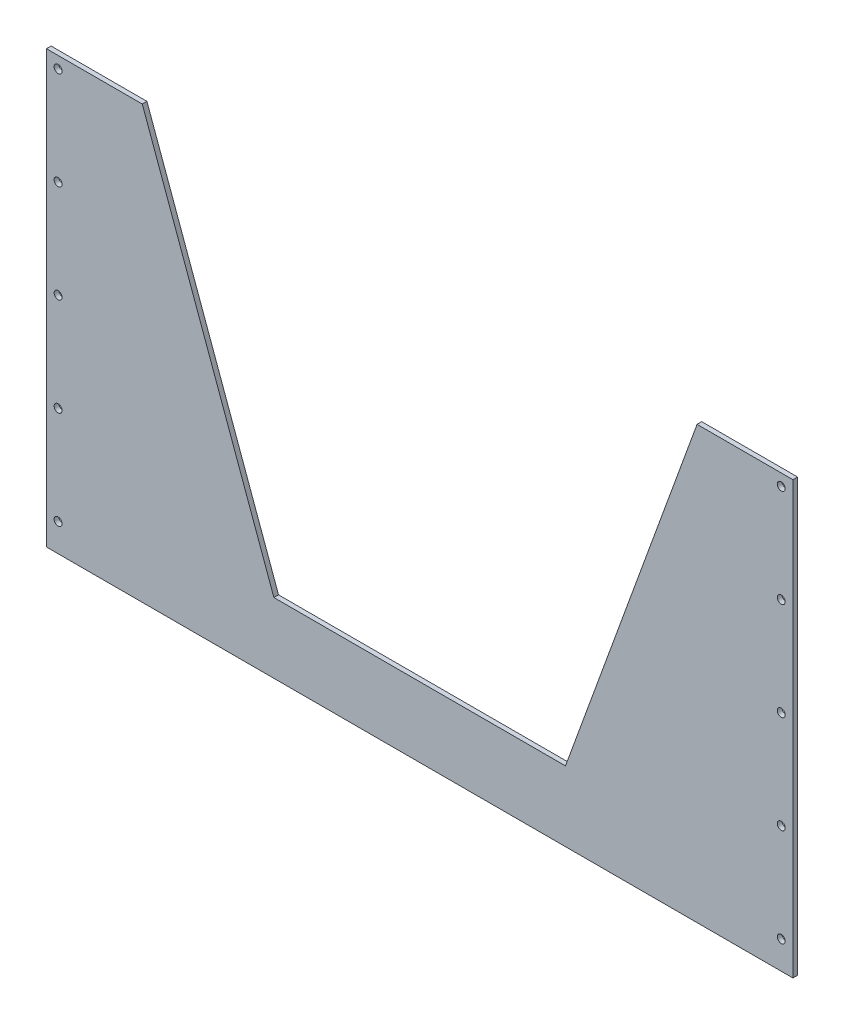
ISO-10303-21;
HEADER;
FILE_DESCRIPTION(('STEP AP214'),'2;1');
FILE_NAME('part.step','',(''),(''),'','','');
FILE_SCHEMA(('AUTOMOTIVE_DESIGN { 1 0 10303 214 1 1 1 1 }'));
ENDSEC;
DATA;
#1=APPLICATION_CONTEXT('core data for automotive mechanical design processes');
#2=APPLICATION_PROTOCOL_DEFINITION('international standard','automotive_design',2000,#1);
#3=PRODUCT_CONTEXT('',#1,'mechanical');
#4=PRODUCT('Part','Part','',(#3));
#5=PRODUCT_RELATED_PRODUCT_CATEGORY('part','',(#4));
#6=PRODUCT_DEFINITION_FORMATION('','',#4);
#7=PRODUCT_DEFINITION_CONTEXT('part definition',#1,'design');
#8=PRODUCT_DEFINITION('design','',#6,#7);
#9=PRODUCT_DEFINITION_SHAPE('','',#8);
#10=(LENGTH_UNIT() NAMED_UNIT(*) SI_UNIT(.MILLI.,.METRE.));
#11=(NAMED_UNIT(*) PLANE_ANGLE_UNIT() SI_UNIT($,.RADIAN.));
#12=(NAMED_UNIT(*) SI_UNIT($,.STERADIAN.) SOLID_ANGLE_UNIT());
#13=UNCERTAINTY_MEASURE_WITH_UNIT(LENGTH_MEASURE(1.E-05),#10,'distance_accuracy_value','');
#14=(GEOMETRIC_REPRESENTATION_CONTEXT(3) GLOBAL_UNCERTAINTY_ASSIGNED_CONTEXT((#13)) GLOBAL_UNIT_ASSIGNED_CONTEXT((#10,
#11,#12)) REPRESENTATION_CONTEXT('',''));
#15=CARTESIAN_POINT('',(0.,0.,0.));
#16=DIRECTION('',(0.,0.,1.));
#17=DIRECTION('',(1.,0.,0.));
#18=AXIS2_PLACEMENT_3D('',#15,#16,#17);
#19=CARTESIAN_POINT('',(160.,92.5,1.));
#20=DIRECTION('',(-1.,0.,0.));
#21=DIRECTION('',(0.,0.,1.));
#22=AXIS2_PLACEMENT_3D('',#19,#20,#21);
#23=PLANE('',#22);
#24=DIRECTION('',(0.,1.,0.));
#25=VECTOR('',#24,1.);
#26=CARTESIAN_POINT('',(160.,92.5,-1.));
#27=LINE('',#26,#25);
#28=CARTESIAN_POINT('',(160.,-92.5,-1.));
#29=VERTEX_POINT('',#28);
#30=CARTESIAN_POINT('',(160.,92.5,-1.));
#31=VERTEX_POINT('',#30);
#32=EDGE_CURVE('E133',#29,#31,#27,.T.);
#33=ORIENTED_EDGE('',*,*,#32,.T.);
#34=DIRECTION('',(0.,0.,-1.));
#35=VECTOR('',#34,1.);
#36=CARTESIAN_POINT('',(160.,92.5,1.));
#37=LINE('',#36,#35);
#38=CARTESIAN_POINT('',(160.,92.5,1.));
#39=VERTEX_POINT('',#38);
#40=EDGE_CURVE('E11',#39,#31,#37,.T.);
#41=ORIENTED_EDGE('',*,*,#40,.F.);
#42=DIRECTION('',(0.,1.,0.));
#43=VECTOR('',#42,1.);
#44=CARTESIAN_POINT('',(160.,92.5,1.));
#45=LINE('',#44,#43);
#46=CARTESIAN_POINT('',(160.,-92.5,1.));
#47=VERTEX_POINT('',#46);
#48=EDGE_CURVE('E147',#47,#39,#45,.T.);
#49=ORIENTED_EDGE('',*,*,#48,.F.);
#50=DIRECTION('',(0.,0.,-1.));
#51=VECTOR('',#50,1.);
#52=CARTESIAN_POINT('',(160.,-92.5,1.));
#53=LINE('',#52,#51);
#54=EDGE_CURVE('E129',#47,#29,#53,.T.);
#55=ORIENTED_EDGE('',*,*,#54,.T.);
#56=EDGE_LOOP('',(#33,#41,#49,#55));
#57=FACE_BOUND('',#56,.T.);
#58=ADVANCED_FACE('F35',(#57),#23,.F.);
#59=CARTESIAN_POINT('',(118.915386311261,92.5,1.));
#60=DIRECTION('',(0.,-1.,0.));
#61=DIRECTION('',(0.,0.,-1.));
#62=AXIS2_PLACEMENT_3D('',#59,#60,#61);
#63=PLANE('',#62);
#64=DIRECTION('',(-1.,0.,0.));
#65=VECTOR('',#64,1.);
#66=CARTESIAN_POINT('',(118.915386311261,92.5,-1.));
#67=LINE('',#66,#65);
#68=CARTESIAN_POINT('',(118.915386311261,92.5,-1.));
#69=VERTEX_POINT('',#68);
#70=EDGE_CURVE('E136',#31,#69,#67,.T.);
#71=ORIENTED_EDGE('',*,*,#70,.T.);
#72=DIRECTION('',(0.,0.,-1.));
#73=VECTOR('',#72,1.);
#74=CARTESIAN_POINT('',(118.915386311261,92.5,1.));
#75=LINE('',#74,#73);
#76=CARTESIAN_POINT('',(118.915386311261,92.5,1.));
#77=VERTEX_POINT('',#76);
#78=EDGE_CURVE('E44',#77,#69,#75,.T.);
#79=ORIENTED_EDGE('',*,*,#78,.F.);
#80=DIRECTION('',(-1.,0.,0.));
#81=VECTOR('',#80,1.);
#82=CARTESIAN_POINT('',(118.915386311261,92.5,1.));
#83=LINE('',#82,#81);
#84=EDGE_CURVE('E96',#39,#77,#83,.T.);
#85=ORIENTED_EDGE('',*,*,#84,.F.);
#86=ORIENTED_EDGE('',*,*,#40,.T.);
#87=EDGE_LOOP('',(#71,#79,#85,#86));
#88=FACE_BOUND('',#87,.T.);
#89=ADVANCED_FACE('F206',(#88),#63,.F.);
#90=CARTESIAN_POINT('',(62.5,-62.5,1.));
#91=DIRECTION('',(0.939692620785909,-0.342020143325666,0.));
#92=DIRECTION('',(0.342020143325666,0.93969262078591,0.));
#93=AXIS2_PLACEMENT_3D('',#90,#91,#92);
#94=PLANE('',#93);
#95=DIRECTION('',(-0.342020143325666,-0.939692620785909,0.));
#96=VECTOR('',#95,1.);
#97=CARTESIAN_POINT('',(62.5,-62.5,-1.));
#98=LINE('',#97,#96);
#99=CARTESIAN_POINT('',(62.5,-62.5,-1.));
#100=VERTEX_POINT('',#99);
#101=EDGE_CURVE('E138',#69,#100,#98,.T.);
#102=ORIENTED_EDGE('',*,*,#101,.T.);
#103=DIRECTION('',(0.,0.,-1.));
#104=VECTOR('',#103,1.);
#105=CARTESIAN_POINT('',(62.5,-62.5,1.));
#106=LINE('',#105,#104);
#107=CARTESIAN_POINT('',(62.5,-62.5,1.));
#108=VERTEX_POINT('',#107);
#109=EDGE_CURVE('E154',#108,#100,#106,.T.);
#110=ORIENTED_EDGE('',*,*,#109,.F.);
#111=DIRECTION('',(-0.342020143325666,-0.939692620785909,0.));
#112=VECTOR('',#111,1.);
#113=CARTESIAN_POINT('',(62.5,-62.5,1.));
#114=LINE('',#113,#112);
#115=EDGE_CURVE('E221',#77,#108,#114,.T.);
#116=ORIENTED_EDGE('',*,*,#115,.F.);
#117=ORIENTED_EDGE('',*,*,#78,.T.);
#118=EDGE_LOOP('',(#102,#110,#116,#117));
#119=FACE_BOUND('',#118,.T.);
#120=ADVANCED_FACE('F211',(#119),#94,.F.);
#121=CARTESIAN_POINT('',(-62.5,-62.5,1.));
#122=DIRECTION('',(0.,-1.,0.));
#123=DIRECTION('',(0.,0.,-1.));
#124=AXIS2_PLACEMENT_3D('',#121,#122,#123);
#125=PLANE('',#124);
#126=DIRECTION('',(-1.,0.,0.));
#127=VECTOR('',#126,1.);
#128=CARTESIAN_POINT('',(-62.5,-62.5,-1.));
#129=LINE('',#128,#127);
#130=CARTESIAN_POINT('',(-62.5,-62.5,-1.));
#131=VERTEX_POINT('',#130);
#132=EDGE_CURVE('E140',#100,#131,#129,.T.);
#133=ORIENTED_EDGE('',*,*,#132,.T.);
#134=DIRECTION('',(0.,0.,-1.));
#135=VECTOR('',#134,1.);
#136=CARTESIAN_POINT('',(-62.5,-62.5,1.));
#137=LINE('',#136,#135);
#138=CARTESIAN_POINT('',(-62.5,-62.5,1.));
#139=VERTEX_POINT('',#138);
#140=EDGE_CURVE('E151',#139,#131,#137,.T.);
#141=ORIENTED_EDGE('',*,*,#140,.F.);
#142=DIRECTION('',(-1.,0.,0.));
#143=VECTOR('',#142,1.);
#144=CARTESIAN_POINT('',(-62.5,-62.5,1.));
#145=LINE('',#144,#143);
#146=EDGE_CURVE('E223',#108,#139,#145,.T.);
#147=ORIENTED_EDGE('',*,*,#146,.F.);
#148=ORIENTED_EDGE('',*,*,#109,.T.);
#149=EDGE_LOOP('',(#133,#141,#147,#148));
#150=FACE_BOUND('',#149,.T.);
#151=ADVANCED_FACE('F287',(#150),#125,.F.);
#152=CARTESIAN_POINT('',(-118.915386311261,92.5,1.));
#153=DIRECTION('',(-0.939692620785909,-0.342020143325666,0.));
#154=DIRECTION('',(0.342020143325666,-0.93969262078591,0.));
#155=AXIS2_PLACEMENT_3D('',#152,#153,#154);
#156=PLANE('',#155);
#157=DIRECTION('',(-0.342020143325666,0.939692620785909,0.));
#158=VECTOR('',#157,1.);
#159=CARTESIAN_POINT('',(-118.915386311261,92.5,-1.));
#160=LINE('',#159,#158);
#161=CARTESIAN_POINT('',(-118.915386311261,92.5,-1.));
#162=VERTEX_POINT('',#161);
#163=EDGE_CURVE('E142',#131,#162,#160,.T.);
#164=ORIENTED_EDGE('',*,*,#163,.T.);
#165=DIRECTION('',(0.,0.,-1.));
#166=VECTOR('',#165,1.);
#167=CARTESIAN_POINT('',(-118.915386311261,92.5,1.));
#168=LINE('',#167,#166);
#169=CARTESIAN_POINT('',(-118.915386311261,92.5,1.));
#170=VERTEX_POINT('',#169);
#171=EDGE_CURVE('E124',#170,#162,#168,.T.);
#172=ORIENTED_EDGE('',*,*,#171,.F.);
#173=DIRECTION('',(-0.342020143325666,0.939692620785909,0.));
#174=VECTOR('',#173,1.);
#175=CARTESIAN_POINT('',(-118.915386311261,92.5,1.));
#176=LINE('',#175,#174);
#177=EDGE_CURVE('E115',#139,#170,#176,.T.);
#178=ORIENTED_EDGE('',*,*,#177,.F.);
#179=ORIENTED_EDGE('',*,*,#140,.T.);
#180=EDGE_LOOP('',(#164,#172,#178,#179));
#181=FACE_BOUND('',#180,.T.);
#182=ADVANCED_FACE('F284',(#181),#156,.F.);
#183=CARTESIAN_POINT('',(-160.,92.5,1.));
#184=DIRECTION('',(0.,-1.,0.));
#185=DIRECTION('',(0.,0.,-1.));
#186=AXIS2_PLACEMENT_3D('',#183,#184,#185);
#187=PLANE('',#186);
#188=DIRECTION('',(-1.,0.,0.));
#189=VECTOR('',#188,1.);
#190=CARTESIAN_POINT('',(-160.,92.5,-1.));
#191=LINE('',#190,#189);
#192=CARTESIAN_POINT('',(-160.,92.5,-1.));
#193=VERTEX_POINT('',#192);
#194=EDGE_CURVE('E123',#162,#193,#191,.T.);
#195=ORIENTED_EDGE('',*,*,#194,.T.);
#196=DIRECTION('',(0.,0.,-1.));
#197=VECTOR('',#196,1.);
#198=CARTESIAN_POINT('',(-160.,92.5,1.));
#199=LINE('',#198,#197);
#200=CARTESIAN_POINT('',(-160.,92.5,1.));
#201=VERTEX_POINT('',#200);
#202=EDGE_CURVE('E120',#201,#193,#199,.T.);
#203=ORIENTED_EDGE('',*,*,#202,.F.);
#204=DIRECTION('',(-1.,0.,0.));
#205=VECTOR('',#204,1.);
#206=CARTESIAN_POINT('',(-160.,92.5,1.));
#207=LINE('',#206,#205);
#208=EDGE_CURVE('E109',#170,#201,#207,.T.);
#209=ORIENTED_EDGE('',*,*,#208,.F.);
#210=ORIENTED_EDGE('',*,*,#171,.T.);
#211=EDGE_LOOP('',(#195,#203,#209,#210));
#212=FACE_BOUND('',#211,.T.);
#213=ADVANCED_FACE('F121',(#212),#187,.F.);
#214=CARTESIAN_POINT('',(-160.,92.5,1.));
#215=DIRECTION('',(1.,0.,0.));
#216=DIRECTION('',(0.,0.,-1.));
#217=AXIS2_PLACEMENT_3D('',#214,#215,#216);
#218=PLANE('',#217);
#219=DIRECTION('',(0.,-1.,0.));
#220=VECTOR('',#219,1.);
#221=CARTESIAN_POINT('',(-160.,92.5,-1.));
#222=LINE('',#221,#220);
#223=CARTESIAN_POINT('',(-160.,-92.5,-1.));
#224=VERTEX_POINT('',#223);
#225=EDGE_CURVE('E82',#193,#224,#222,.T.);
#226=ORIENTED_EDGE('',*,*,#225,.T.);
#227=DIRECTION('',(0.,0.,-1.));
#228=VECTOR('',#227,1.);
#229=CARTESIAN_POINT('',(-160.,-92.5,1.));
#230=LINE('',#229,#228);
#231=CARTESIAN_POINT('',(-160.,-92.5,1.));
#232=VERTEX_POINT('',#231);
#233=EDGE_CURVE('E125',#232,#224,#230,.T.);
#234=ORIENTED_EDGE('',*,*,#233,.F.);
#235=DIRECTION('',(0.,-1.,0.));
#236=VECTOR('',#235,1.);
#237=CARTESIAN_POINT('',(-160.,92.5,1.));
#238=LINE('',#237,#236);
#239=EDGE_CURVE('E113',#201,#232,#238,.T.);
#240=ORIENTED_EDGE('',*,*,#239,.F.);
#241=ORIENTED_EDGE('',*,*,#202,.T.);
#242=EDGE_LOOP('',(#226,#234,#240,#241));
#243=FACE_BOUND('',#242,.T.);
#244=ADVANCED_FACE('F127',(#243),#218,.F.);
#245=CARTESIAN_POINT('',(-160.,-92.5,1.));
#246=DIRECTION('',(0.,1.,0.));
#247=DIRECTION('',(0.,0.,1.));
#248=AXIS2_PLACEMENT_3D('',#245,#246,#247);
#249=PLANE('',#248);
#250=DIRECTION('',(1.,0.,0.));
#251=VECTOR('',#250,1.);
#252=CARTESIAN_POINT('',(-160.,-92.5,-1.));
#253=LINE('',#252,#251);
#254=EDGE_CURVE('E88',#224,#29,#253,.T.);
#255=ORIENTED_EDGE('',*,*,#254,.T.);
#256=ORIENTED_EDGE('',*,*,#54,.F.);
#257=DIRECTION('',(1.,0.,0.));
#258=VECTOR('',#257,1.);
#259=CARTESIAN_POINT('',(-160.,-92.5,1.));
#260=LINE('',#259,#258);
#261=EDGE_CURVE('E53',#232,#47,#260,.T.);
#262=ORIENTED_EDGE('',*,*,#261,.F.);
#263=ORIENTED_EDGE('',*,*,#233,.T.);
#264=EDGE_LOOP('',(#255,#256,#262,#263));
#265=FACE_BOUND('',#264,.T.);
#266=ADVANCED_FACE('F263',(#265),#249,.F.);
#267=CARTESIAN_POINT('',(0.,0.,1.));
#268=DIRECTION('',(0.,0.,1.));
#269=DIRECTION('',(1.,0.,0.));
#270=AXIS2_PLACEMENT_3D('',#267,#268,#269);
#271=PLANE('',#270);
#272=CARTESIAN_POINT('',(155.,87.5,1.));
#273=DIRECTION('',(0.,0.,1.));
#274=DIRECTION('',(-1.,0.,0.));
#275=AXIS2_PLACEMENT_3D('',#272,#273,#274);
#276=CIRCLE('',#275,1.70000000000001);
#277=CARTESIAN_POINT('',(153.3,87.5,1.));
#278=VERTEX_POINT('',#277);
#279=EDGE_CURVE('E232',#278,#278,#276,.T.);
#280=ORIENTED_EDGE('',*,*,#279,.F.);
#281=EDGE_LOOP('',(#280));
#282=FACE_BOUND('',#281,.T.);
#283=CARTESIAN_POINT('',(155.,45.5,1.));
#284=DIRECTION('',(0.,0.,1.));
#285=DIRECTION('',(-1.,0.,0.));
#286=AXIS2_PLACEMENT_3D('',#283,#284,#285);
#287=CIRCLE('',#286,1.70000000000001);
#288=CARTESIAN_POINT('',(153.3,45.5,1.));
#289=VERTEX_POINT('',#288);
#290=EDGE_CURVE('E234',#289,#289,#287,.T.);
#291=ORIENTED_EDGE('',*,*,#290,.F.);
#292=EDGE_LOOP('',(#291));
#293=FACE_BOUND('',#292,.T.);
#294=CARTESIAN_POINT('',(154.999999999999,3.49999999999999,1.));
#295=DIRECTION('',(0.,0.,1.));
#296=DIRECTION('',(-1.,0.,0.));
#297=AXIS2_PLACEMENT_3D('',#294,#295,#296);
#298=CIRCLE('',#297,1.70000000000001);
#299=CARTESIAN_POINT('',(153.299999999999,3.49999999999999,1.));
#300=VERTEX_POINT('',#299);
#301=EDGE_CURVE('E237',#300,#300,#298,.T.);
#302=ORIENTED_EDGE('',*,*,#301,.F.);
#303=EDGE_LOOP('',(#302));
#304=FACE_BOUND('',#303,.T.);
#305=CARTESIAN_POINT('',(154.999999999999,-38.5,1.));
#306=DIRECTION('',(0.,0.,1.));
#307=DIRECTION('',(-1.,0.,0.));
#308=AXIS2_PLACEMENT_3D('',#305,#306,#307);
#309=CIRCLE('',#308,1.70000000000001);
#310=CARTESIAN_POINT('',(153.299999999999,-38.5,1.));
#311=VERTEX_POINT('',#310);
#312=EDGE_CURVE('E240',#311,#311,#309,.T.);
#313=ORIENTED_EDGE('',*,*,#312,.F.);
#314=EDGE_LOOP('',(#313));
#315=FACE_BOUND('',#314,.T.);
#316=CARTESIAN_POINT('',(154.999999999998,-80.5,1.));
#317=DIRECTION('',(0.,0.,1.));
#318=DIRECTION('',(-1.,0.,0.));
#319=AXIS2_PLACEMENT_3D('',#316,#317,#318);
#320=CIRCLE('',#319,1.70000000000001);
#321=CARTESIAN_POINT('',(153.299999999998,-80.5,1.));
#322=VERTEX_POINT('',#321);
#323=EDGE_CURVE('E243',#322,#322,#320,.T.);
#324=ORIENTED_EDGE('',*,*,#323,.F.);
#325=EDGE_LOOP('',(#324));
#326=FACE_BOUND('',#325,.T.);
#327=CARTESIAN_POINT('',(-154.999999999998,-80.5,1.));
#328=DIRECTION('',(0.,0.,1.));
#329=DIRECTION('',(1.,0.,0.));
#330=AXIS2_PLACEMENT_3D('',#327,#328,#329);
#331=CIRCLE('',#330,1.70000000000001);
#332=CARTESIAN_POINT('',(-153.299999999998,-80.5,1.));
#333=VERTEX_POINT('',#332);
#334=EDGE_CURVE('E246',#333,#333,#331,.T.);
#335=ORIENTED_EDGE('',*,*,#334,.F.);
#336=EDGE_LOOP('',(#335));
#337=FACE_BOUND('',#336,.T.);
#338=CARTESIAN_POINT('',(-154.999999999999,-38.5,1.));
#339=DIRECTION('',(0.,0.,1.));
#340=DIRECTION('',(1.,0.,0.));
#341=AXIS2_PLACEMENT_3D('',#338,#339,#340);
#342=CIRCLE('',#341,1.70000000000001);
#343=CARTESIAN_POINT('',(-153.299999999999,-38.5,1.));
#344=VERTEX_POINT('',#343);
#345=EDGE_CURVE('E249',#344,#344,#342,.T.);
#346=ORIENTED_EDGE('',*,*,#345,.F.);
#347=EDGE_LOOP('',(#346));
#348=FACE_BOUND('',#347,.T.);
#349=CARTESIAN_POINT('',(-154.999999999999,3.49999999999999,1.));
#350=DIRECTION('',(0.,0.,1.));
#351=DIRECTION('',(1.,0.,0.));
#352=AXIS2_PLACEMENT_3D('',#349,#350,#351);
#353=CIRCLE('',#352,1.70000000000001);
#354=CARTESIAN_POINT('',(-153.299999999999,3.49999999999999,1.));
#355=VERTEX_POINT('',#354);
#356=EDGE_CURVE('E252',#355,#355,#353,.T.);
#357=ORIENTED_EDGE('',*,*,#356,.F.);
#358=EDGE_LOOP('',(#357));
#359=FACE_BOUND('',#358,.T.);
#360=CARTESIAN_POINT('',(-155.,45.5,1.));
#361=DIRECTION('',(0.,0.,1.));
#362=DIRECTION('',(1.,0.,0.));
#363=AXIS2_PLACEMENT_3D('',#360,#361,#362);
#364=CIRCLE('',#363,1.70000000000001);
#365=CARTESIAN_POINT('',(-153.3,45.5,1.));
#366=VERTEX_POINT('',#365);
#367=EDGE_CURVE('E231',#366,#366,#364,.T.);
#368=ORIENTED_EDGE('',*,*,#367,.F.);
#369=EDGE_LOOP('',(#368));
#370=FACE_BOUND('',#369,.T.);
#371=CARTESIAN_POINT('',(-155.,87.5,1.));
#372=DIRECTION('',(0.,0.,1.));
#373=DIRECTION('',(1.,0.,0.));
#374=AXIS2_PLACEMENT_3D('',#371,#372,#373);
#375=CIRCLE('',#374,1.70000000000001);
#376=CARTESIAN_POINT('',(-153.3,87.5,1.));
#377=VERTEX_POINT('',#376);
#378=EDGE_CURVE('E163',#377,#377,#375,.T.);
#379=ORIENTED_EDGE('',*,*,#378,.F.);
#380=EDGE_LOOP('',(#379));
#381=FACE_BOUND('',#380,.T.);
#382=ORIENTED_EDGE('',*,*,#48,.T.);
#383=ORIENTED_EDGE('',*,*,#84,.T.);
#384=ORIENTED_EDGE('',*,*,#115,.T.);
#385=ORIENTED_EDGE('',*,*,#146,.T.);
#386=ORIENTED_EDGE('',*,*,#177,.T.);
#387=ORIENTED_EDGE('',*,*,#208,.T.);
#388=ORIENTED_EDGE('',*,*,#239,.T.);
#389=ORIENTED_EDGE('',*,*,#261,.T.);
#390=EDGE_LOOP('',(#382,#383,#384,#385,#386,#387,#388,#389));
#391=FACE_BOUND('',#390,.T.);
#392=ADVANCED_FACE('F111',(#282,#293,#304,#315,#326,#337,#348,#359,#370,#381,#391),#271,.T.);
#393=CARTESIAN_POINT('',(0.,0.,-1.));
#394=DIRECTION('',(0.,0.,1.));
#395=DIRECTION('',(1.,0.,0.));
#396=AXIS2_PLACEMENT_3D('',#393,#394,#395);
#397=PLANE('',#396);
#398=CARTESIAN_POINT('',(155.,87.5,-1.));
#399=DIRECTION('',(0.,0.,1.));
#400=DIRECTION('',(1.,0.,0.));
#401=AXIS2_PLACEMENT_3D('',#398,#399,#400);
#402=CIRCLE('',#401,1.70000000000001);
#403=CARTESIAN_POINT('',(156.7,87.5,-1.));
#404=VERTEX_POINT('',#403);
#405=EDGE_CURVE('E38',#404,#404,#402,.T.);
#406=ORIENTED_EDGE('',*,*,#405,.T.);
#407=EDGE_LOOP('',(#406));
#408=FACE_BOUND('',#407,.T.);
#409=CARTESIAN_POINT('',(155.,45.5,-1.));
#410=DIRECTION('',(0.,0.,1.));
#411=DIRECTION('',(1.,0.,0.));
#412=AXIS2_PLACEMENT_3D('',#409,#410,#411);
#413=CIRCLE('',#412,1.70000000000001);
#414=CARTESIAN_POINT('',(156.7,45.5,-1.));
#415=VERTEX_POINT('',#414);
#416=EDGE_CURVE('E183',#415,#415,#413,.T.);
#417=ORIENTED_EDGE('',*,*,#416,.T.);
#418=EDGE_LOOP('',(#417));
#419=FACE_BOUND('',#418,.T.);
#420=CARTESIAN_POINT('',(154.999999999999,3.49999999999999,-1.));
#421=DIRECTION('',(0.,0.,1.));
#422=DIRECTION('',(1.,0.,0.));
#423=AXIS2_PLACEMENT_3D('',#420,#421,#422);
#424=CIRCLE('',#423,1.70000000000001);
#425=CARTESIAN_POINT('',(156.699999999999,3.49999999999999,-1.));
#426=VERTEX_POINT('',#425);
#427=EDGE_CURVE('E181',#426,#426,#424,.T.);
#428=ORIENTED_EDGE('',*,*,#427,.T.);
#429=EDGE_LOOP('',(#428));
#430=FACE_BOUND('',#429,.T.);
#431=CARTESIAN_POINT('',(154.999999999999,-38.5,-1.));
#432=DIRECTION('',(0.,0.,1.));
#433=DIRECTION('',(1.,0.,0.));
#434=AXIS2_PLACEMENT_3D('',#431,#432,#433);
#435=CIRCLE('',#434,1.70000000000001);
#436=CARTESIAN_POINT('',(156.699999999999,-38.5,-1.));
#437=VERTEX_POINT('',#436);
#438=EDGE_CURVE('E178',#437,#437,#435,.T.);
#439=ORIENTED_EDGE('',*,*,#438,.T.);
#440=EDGE_LOOP('',(#439));
#441=FACE_BOUND('',#440,.T.);
#442=CARTESIAN_POINT('',(154.999999999998,-80.5,-1.));
#443=DIRECTION('',(0.,0.,1.));
#444=DIRECTION('',(1.,0.,0.));
#445=AXIS2_PLACEMENT_3D('',#442,#443,#444);
#446=CIRCLE('',#445,1.70000000000001);
#447=CARTESIAN_POINT('',(156.699999999998,-80.5,-1.));
#448=VERTEX_POINT('',#447);
#449=EDGE_CURVE('E175',#448,#448,#446,.T.);
#450=ORIENTED_EDGE('',*,*,#449,.T.);
#451=EDGE_LOOP('',(#450));
#452=FACE_BOUND('',#451,.T.);
#453=CARTESIAN_POINT('',(-154.999999999998,-80.5,-1.));
#454=DIRECTION('',(0.,0.,1.));
#455=DIRECTION('',(1.,0.,0.));
#456=AXIS2_PLACEMENT_3D('',#453,#454,#455);
#457=CIRCLE('',#456,1.70000000000001);
#458=CARTESIAN_POINT('',(-153.299999999998,-80.5,-1.));
#459=VERTEX_POINT('',#458);
#460=EDGE_CURVE('E172',#459,#459,#457,.T.);
#461=ORIENTED_EDGE('',*,*,#460,.T.);
#462=EDGE_LOOP('',(#461));
#463=FACE_BOUND('',#462,.T.);
#464=CARTESIAN_POINT('',(-154.999999999999,-38.5,-1.));
#465=DIRECTION('',(0.,0.,1.));
#466=DIRECTION('',(1.,0.,0.));
#467=AXIS2_PLACEMENT_3D('',#464,#465,#466);
#468=CIRCLE('',#467,1.70000000000001);
#469=CARTESIAN_POINT('',(-153.299999999999,-38.5,-1.));
#470=VERTEX_POINT('',#469);
#471=EDGE_CURVE('E169',#470,#470,#468,.T.);
#472=ORIENTED_EDGE('',*,*,#471,.T.);
#473=EDGE_LOOP('',(#472));
#474=FACE_BOUND('',#473,.T.);
#475=CARTESIAN_POINT('',(-154.999999999999,3.49999999999999,-1.));
#476=DIRECTION('',(0.,0.,1.));
#477=DIRECTION('',(1.,0.,0.));
#478=AXIS2_PLACEMENT_3D('',#475,#476,#477);
#479=CIRCLE('',#478,1.70000000000001);
#480=CARTESIAN_POINT('',(-153.299999999999,3.49999999999999,-1.));
#481=VERTEX_POINT('',#480);
#482=EDGE_CURVE('E166',#481,#481,#479,.T.);
#483=ORIENTED_EDGE('',*,*,#482,.T.);
#484=EDGE_LOOP('',(#483));
#485=FACE_BOUND('',#484,.T.);
#486=CARTESIAN_POINT('',(-155.,45.5,-1.));
#487=DIRECTION('',(0.,0.,1.));
#488=DIRECTION('',(1.,0.,0.));
#489=AXIS2_PLACEMENT_3D('',#486,#487,#488);
#490=CIRCLE('',#489,1.70000000000001);
#491=CARTESIAN_POINT('',(-153.3,45.5,-1.));
#492=VERTEX_POINT('',#491);
#493=EDGE_CURVE('E162',#492,#492,#490,.T.);
#494=ORIENTED_EDGE('',*,*,#493,.T.);
#495=EDGE_LOOP('',(#494));
#496=FACE_BOUND('',#495,.T.);
#497=CARTESIAN_POINT('',(-155.,87.5,-1.));
#498=DIRECTION('',(0.,0.,1.));
#499=DIRECTION('',(1.,0.,0.));
#500=AXIS2_PLACEMENT_3D('',#497,#498,#499);
#501=CIRCLE('',#500,1.70000000000001);
#502=CARTESIAN_POINT('',(-153.3,87.5,-1.));
#503=VERTEX_POINT('',#502);
#504=EDGE_CURVE('E159',#503,#503,#501,.T.);
#505=ORIENTED_EDGE('',*,*,#504,.T.);
#506=EDGE_LOOP('',(#505));
#507=FACE_BOUND('',#506,.T.);
#508=ORIENTED_EDGE('',*,*,#32,.F.);
#509=ORIENTED_EDGE('',*,*,#254,.F.);
#510=ORIENTED_EDGE('',*,*,#225,.F.);
#511=ORIENTED_EDGE('',*,*,#194,.F.);
#512=ORIENTED_EDGE('',*,*,#163,.F.);
#513=ORIENTED_EDGE('',*,*,#132,.F.);
#514=ORIENTED_EDGE('',*,*,#101,.F.);
#515=ORIENTED_EDGE('',*,*,#70,.F.);
#516=EDGE_LOOP('',(#508,#509,#510,#511,#512,#513,#514,#515));
#517=FACE_BOUND('',#516,.T.);
#518=ADVANCED_FACE('F190',(#408,#419,#430,#441,#452,#463,#474,#485,#496,#507,#517),#397,.F.);
#519=CARTESIAN_POINT('',(-155.,87.5,-9.));
#520=DIRECTION('',(0.,0.,1.));
#521=DIRECTION('',(1.,0.,0.));
#522=AXIS2_PLACEMENT_3D('',#519,#520,#521);
#523=CYLINDRICAL_SURFACE('',#522,1.70000000000001);
#524=ORIENTED_EDGE('',*,*,#378,.T.);
#525=EDGE_LOOP('',(#524));
#526=FACE_BOUND('',#525,.T.);
#527=ORIENTED_EDGE('',*,*,#504,.F.);
#528=EDGE_LOOP('',(#527));
#529=FACE_BOUND('',#528,.T.);
#530=ADVANCED_FACE('F268',(#526,#529),#523,.F.);
#531=CARTESIAN_POINT('',(-155.,45.5,-9.));
#532=DIRECTION('',(0.,0.,1.));
#533=DIRECTION('',(1.,0.,0.));
#534=AXIS2_PLACEMENT_3D('',#531,#532,#533);
#535=CYLINDRICAL_SURFACE('',#534,1.70000000000001);
#536=ORIENTED_EDGE('',*,*,#367,.T.);
#537=EDGE_LOOP('',(#536));
#538=FACE_BOUND('',#537,.T.);
#539=ORIENTED_EDGE('',*,*,#493,.F.);
#540=EDGE_LOOP('',(#539));
#541=FACE_BOUND('',#540,.T.);
#542=ADVANCED_FACE('F258',(#538,#541),#535,.F.);
#543=CARTESIAN_POINT('',(-154.999999999999,3.49999999999999,-9.));
#544=DIRECTION('',(0.,0.,1.));
#545=DIRECTION('',(1.,0.,0.));
#546=AXIS2_PLACEMENT_3D('',#543,#544,#545);
#547=CYLINDRICAL_SURFACE('',#546,1.70000000000001);
#548=ORIENTED_EDGE('',*,*,#356,.T.);
#549=EDGE_LOOP('',(#548));
#550=FACE_BOUND('',#549,.T.);
#551=ORIENTED_EDGE('',*,*,#482,.F.);
#552=EDGE_LOOP('',(#551));
#553=FACE_BOUND('',#552,.T.);
#554=ADVANCED_FACE('F340',(#550,#553),#547,.F.);
#555=CARTESIAN_POINT('',(-154.999999999999,-38.5,-9.));
#556=DIRECTION('',(0.,0.,1.));
#557=DIRECTION('',(1.,0.,0.));
#558=AXIS2_PLACEMENT_3D('',#555,#556,#557);
#559=CYLINDRICAL_SURFACE('',#558,1.70000000000001);
#560=ORIENTED_EDGE('',*,*,#345,.T.);
#561=EDGE_LOOP('',(#560));
#562=FACE_BOUND('',#561,.T.);
#563=ORIENTED_EDGE('',*,*,#471,.F.);
#564=EDGE_LOOP('',(#563));
#565=FACE_BOUND('',#564,.T.);
#566=ADVANCED_FACE('F349',(#562,#565),#559,.F.);
#567=CARTESIAN_POINT('',(-154.999999999998,-80.5,-9.));
#568=DIRECTION('',(0.,0.,1.));
#569=DIRECTION('',(1.,0.,0.));
#570=AXIS2_PLACEMENT_3D('',#567,#568,#569);
#571=CYLINDRICAL_SURFACE('',#570,1.70000000000001);
#572=ORIENTED_EDGE('',*,*,#334,.T.);
#573=EDGE_LOOP('',(#572));
#574=FACE_BOUND('',#573,.T.);
#575=ORIENTED_EDGE('',*,*,#460,.F.);
#576=EDGE_LOOP('',(#575));
#577=FACE_BOUND('',#576,.T.);
#578=ADVANCED_FACE('F359',(#574,#577),#571,.F.);
#579=CARTESIAN_POINT('',(154.999999999998,-80.5,-9.));
#580=DIRECTION('',(0.,0.,1.));
#581=DIRECTION('',(1.,0.,0.));
#582=AXIS2_PLACEMENT_3D('',#579,#580,#581);
#583=CYLINDRICAL_SURFACE('',#582,1.70000000000001);
#584=ORIENTED_EDGE('',*,*,#323,.T.);
#585=EDGE_LOOP('',(#584));
#586=FACE_BOUND('',#585,.T.);
#587=ORIENTED_EDGE('',*,*,#449,.F.);
#588=EDGE_LOOP('',(#587));
#589=FACE_BOUND('',#588,.T.);
#590=ADVANCED_FACE('F369',(#586,#589),#583,.F.);
#591=CARTESIAN_POINT('',(154.999999999999,-38.5,-9.));
#592=DIRECTION('',(0.,0.,1.));
#593=DIRECTION('',(1.,0.,0.));
#594=AXIS2_PLACEMENT_3D('',#591,#592,#593);
#595=CYLINDRICAL_SURFACE('',#594,1.70000000000001);
#596=ORIENTED_EDGE('',*,*,#312,.T.);
#597=EDGE_LOOP('',(#596));
#598=FACE_BOUND('',#597,.T.);
#599=ORIENTED_EDGE('',*,*,#438,.F.);
#600=EDGE_LOOP('',(#599));
#601=FACE_BOUND('',#600,.T.);
#602=ADVANCED_FACE('F379',(#598,#601),#595,.F.);
#603=CARTESIAN_POINT('',(154.999999999999,3.49999999999999,-9.));
#604=DIRECTION('',(0.,0.,1.));
#605=DIRECTION('',(1.,0.,0.));
#606=AXIS2_PLACEMENT_3D('',#603,#604,#605);
#607=CYLINDRICAL_SURFACE('',#606,1.70000000000001);
#608=ORIENTED_EDGE('',*,*,#301,.T.);
#609=EDGE_LOOP('',(#608));
#610=FACE_BOUND('',#609,.T.);
#611=ORIENTED_EDGE('',*,*,#427,.F.);
#612=EDGE_LOOP('',(#611));
#613=FACE_BOUND('',#612,.T.);
#614=ADVANCED_FACE('F200',(#610,#613),#607,.F.);
#615=CARTESIAN_POINT('',(155.,45.5,-9.));
#616=DIRECTION('',(0.,0.,1.));
#617=DIRECTION('',(1.,0.,0.));
#618=AXIS2_PLACEMENT_3D('',#615,#616,#617);
#619=CYLINDRICAL_SURFACE('',#618,1.70000000000001);
#620=ORIENTED_EDGE('',*,*,#290,.T.);
#621=EDGE_LOOP('',(#620));
#622=FACE_BOUND('',#621,.T.);
#623=ORIENTED_EDGE('',*,*,#416,.F.);
#624=EDGE_LOOP('',(#623));
#625=FACE_BOUND('',#624,.T.);
#626=ADVANCED_FACE('F194',(#622,#625),#619,.F.);
#627=CARTESIAN_POINT('',(155.,87.5,-9.));
#628=DIRECTION('',(0.,0.,1.));
#629=DIRECTION('',(1.,0.,0.));
#630=AXIS2_PLACEMENT_3D('',#627,#628,#629);
#631=CYLINDRICAL_SURFACE('',#630,1.70000000000001);
#632=ORIENTED_EDGE('',*,*,#279,.T.);
#633=EDGE_LOOP('',(#632));
#634=FACE_BOUND('',#633,.T.);
#635=ORIENTED_EDGE('',*,*,#405,.F.);
#636=EDGE_LOOP('',(#635));
#637=FACE_BOUND('',#636,.T.);
#638=ADVANCED_FACE('F192',(#634,#637),#631,.F.);
#639=CLOSED_SHELL('',(#58,#89,#120,#151,#182,#213,#244,#266,#392,#518,#530,#542,#554,#566,#578,
#590,#602,#614,#626,#638));
#640=MANIFOLD_SOLID_BREP('B2',#639);
#641=ADVANCED_BREP_SHAPE_REPRESENTATION('',(#18,#640),#14);
#642=SHAPE_DEFINITION_REPRESENTATION(#9,#641);
ENDSEC;
END-ISO-10303-21;
